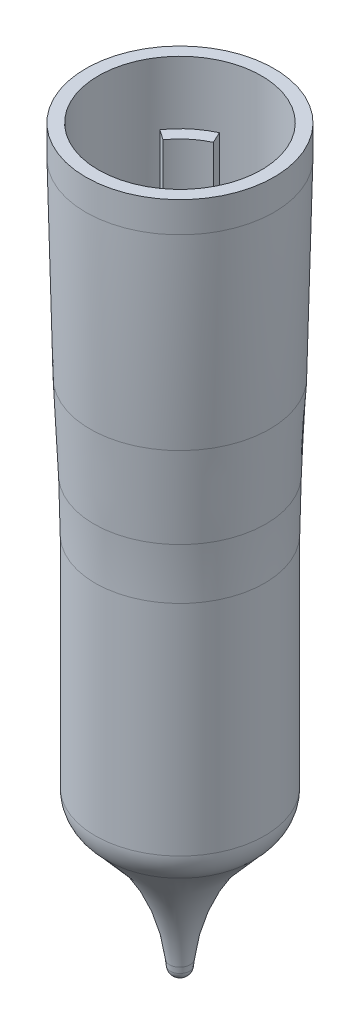
ISO-10303-21;
HEADER;
FILE_DESCRIPTION(('STEP AP214'),'2;1');
FILE_NAME('part.step','',(''),(''),'','','');
FILE_SCHEMA(('AUTOMOTIVE_DESIGN { 1 0 10303 214 1 1 1 1 }'));
ENDSEC;
DATA;
#1=APPLICATION_CONTEXT('core data for automotive mechanical design processes');
#2=APPLICATION_PROTOCOL_DEFINITION('international standard','automotive_design',2000,#1);
#3=PRODUCT_CONTEXT('',#1,'mechanical');
#4=PRODUCT('Part','Part','',(#3));
#5=PRODUCT_RELATED_PRODUCT_CATEGORY('part','',(#4));
#6=PRODUCT_DEFINITION_FORMATION('','',#4);
#7=PRODUCT_DEFINITION_CONTEXT('part definition',#1,'design');
#8=PRODUCT_DEFINITION('design','',#6,#7);
#9=PRODUCT_DEFINITION_SHAPE('','',#8);
#10=(LENGTH_UNIT() NAMED_UNIT(*) SI_UNIT(.MILLI.,.METRE.));
#11=(NAMED_UNIT(*) PLANE_ANGLE_UNIT() SI_UNIT($,.RADIAN.));
#12=(NAMED_UNIT(*) SI_UNIT($,.STERADIAN.) SOLID_ANGLE_UNIT());
#13=UNCERTAINTY_MEASURE_WITH_UNIT(LENGTH_MEASURE(1.E-05),#10,'distance_accuracy_value','');
#14=(GEOMETRIC_REPRESENTATION_CONTEXT(3) GLOBAL_UNCERTAINTY_ASSIGNED_CONTEXT((#13)) GLOBAL_UNIT_ASSIGNED_CONTEXT((#10,
#11,#12)) REPRESENTATION_CONTEXT('',''));
#15=CARTESIAN_POINT('',(0.,0.,0.));
#16=DIRECTION('',(0.,0.,1.));
#17=DIRECTION('',(1.,0.,0.));
#18=AXIS2_PLACEMENT_3D('',#15,#16,#17);
#19=CARTESIAN_POINT('',(0.,33.,0.));
#20=DIRECTION('',(0.,1.,0.));
#21=DIRECTION('',(0.,0.,1.));
#22=AXIS2_PLACEMENT_3D('',#19,#20,#21);
#23=CYLINDRICAL_SURFACE('',#22,6.5);
#24=CARTESIAN_POINT('',(0.,45.,0.));
#25=DIRECTION('',(0.,1.,0.));
#26=DIRECTION('',(0.,0.,1.));
#27=AXIS2_PLACEMENT_3D('',#24,#25,#26);
#28=CIRCLE('',#27,6.5);
#29=CARTESIAN_POINT('',(0.,45.,6.5));
#30=VERTEX_POINT('',#29);
#31=EDGE_CURVE('E114',#30,#30,#28,.T.);
#32=ORIENTED_EDGE('',*,*,#31,.T.);
#33=EDGE_LOOP('',(#32));
#34=FACE_BOUND('',#33,.T.);
#35=DIRECTION('',(0.,-1.,0.));
#36=VECTOR('',#35,1.);
#37=CARTESIAN_POINT('',(-5.32448828787845,49.0605455480127,-3.72824683628179));
#38=LINE('',#37,#36);
#39=CARTESIAN_POINT('',(-5.32448828787845,40.,-3.72824683628179));
#40=VERTEX_POINT('',#39);
#41=CARTESIAN_POINT('',(-5.32448828787845,33.,-3.72824683628179));
#42=VERTEX_POINT('',#41);
#43=EDGE_CURVE('E86',#40,#42,#38,.T.);
#44=ORIENTED_EDGE('',*,*,#43,.F.);
#45=CARTESIAN_POINT('',(0.,40.,0.));
#46=DIRECTION('',(0.,1.,0.));
#47=DIRECTION('',(0.,0.,1.));
#48=AXIS2_PLACEMENT_3D('',#45,#46,#47);
#49=CIRCLE('',#48,6.5);
#50=CARTESIAN_POINT('',(-2.74701870131455,40.,-5.89100061573822));
#51=VERTEX_POINT('',#50);
#52=EDGE_CURVE('E92',#51,#40,#49,.T.);
#53=ORIENTED_EDGE('',*,*,#52,.F.);
#54=DIRECTION('',(0.,-1.,0.));
#55=VECTOR('',#54,1.);
#56=CARTESIAN_POINT('',(-2.74701870131455,49.0605455480127,-5.89100061573822));
#57=LINE('',#56,#55);
#58=CARTESIAN_POINT('',(-2.74701870131455,33.,-5.89100061573822));
#59=VERTEX_POINT('',#58);
#60=EDGE_CURVE('E62',#51,#59,#57,.T.);
#61=ORIENTED_EDGE('',*,*,#60,.T.);
#62=CARTESIAN_POINT('',(0.,33.,0.));
#63=DIRECTION('',(0.,1.,0.));
#64=DIRECTION('',(0.,0.,1.));
#65=AXIS2_PLACEMENT_3D('',#62,#63,#64);
#66=CIRCLE('',#65,6.5);
#67=EDGE_CURVE('E101',#42,#59,#66,.T.);
#68=ORIENTED_EDGE('',*,*,#67,.F.);
#69=EDGE_LOOP('',(#44,#53,#61,#68));
#70=FACE_BOUND('',#69,.T.);
#71=ADVANCED_FACE('F39',(#34,#70),#23,.F.);
#72=CARTESIAN_POINT('',(0.,33.,0.));
#73=DIRECTION('',(0.,1.,0.));
#74=DIRECTION('',(0.,0.,1.));
#75=AXIS2_PLACEMENT_3D('',#72,#73,#74);
#76=PLANE('',#75);
#77=CARTESIAN_POINT('',(0.,33.,0.));
#78=DIRECTION('',(0.,-1.,0.));
#79=DIRECTION('',(0.,0.,1.));
#80=AXIS2_PLACEMENT_3D('',#77,#78,#79);
#81=CIRCLE('',#80,5.5);
#82=CARTESIAN_POINT('',(-4.50533624358946,33.,-3.15467039993074));
#83=VERTEX_POINT('',#82);
#84=CARTESIAN_POINT('',(-2.32440043957385,33.,-4.98469282870157));
#85=VERTEX_POINT('',#84);
#86=EDGE_CURVE('E54',#83,#85,#81,.T.);
#87=ORIENTED_EDGE('',*,*,#86,.F.);
#88=DIRECTION('',(0.819152044288993,0.,0.573576436351044));
#89=VECTOR('',#88,1.);
#90=CARTESIAN_POINT('',(-5.32448828787845,33.,-3.72824683628179));
#91=LINE('',#90,#89);
#92=EDGE_CURVE('E102',#42,#83,#91,.T.);
#93=ORIENTED_EDGE('',*,*,#92,.F.);
#94=ORIENTED_EDGE('',*,*,#67,.T.);
#95=DIRECTION('',(-0.4226182617407,0.,-0.90630778703665));
#96=VECTOR('',#95,1.);
#97=CARTESIAN_POINT('',(-2.32440043957385,33.,-4.98469282870157));
#98=LINE('',#97,#96);
#99=EDGE_CURVE('E110',#85,#59,#98,.T.);
#100=ORIENTED_EDGE('',*,*,#99,.F.);
#101=EDGE_LOOP('',(#87,#93,#94,#100));
#102=FACE_BOUND('',#101,.T.);
#103=ADVANCED_FACE('F155',(#102),#76,.T.);
#104=CARTESIAN_POINT('',(0.,18.6675522733988,0.));
#105=DIRECTION('',(0.,-1.,0.));
#106=DIRECTION('',(0.,0.,-1.));
#107=AXIS2_PLACEMENT_3D('',#104,#105,#106);
#108=CYLINDRICAL_SURFACE('',#107,6.75);
#109=CARTESIAN_POINT('',(0.,16.6022019394308,0.));
#110=DIRECTION('',(0.,1.,0.));
#111=DIRECTION('',(0.,0.,1.));
#112=AXIS2_PLACEMENT_3D('',#109,#110,#111);
#113=CIRCLE('',#112,6.75);
#114=CARTESIAN_POINT('',(0.,16.6022019394308,6.75));
#115=VERTEX_POINT('',#114);
#116=EDGE_CURVE('E131',#115,#115,#113,.F.);
#117=ORIENTED_EDGE('',*,*,#116,.T.);
#118=EDGE_LOOP('',(#117));
#119=FACE_BOUND('',#118,.T.);
#120=CARTESIAN_POINT('',(0.,-0.83244772660123,0.));
#121=DIRECTION('',(0.,1.,0.));
#122=DIRECTION('',(0.,0.,1.));
#123=AXIS2_PLACEMENT_3D('',#120,#121,#122);
#124=CIRCLE('',#123,6.75);
#125=CARTESIAN_POINT('',(0.,-0.83244772660123,6.75));
#126=VERTEX_POINT('',#125);
#127=EDGE_CURVE('E119',#126,#126,#124,.T.);
#128=ORIENTED_EDGE('',*,*,#127,.T.);
#129=EDGE_LOOP('',(#128));
#130=FACE_BOUND('',#129,.T.);
#131=ADVANCED_FACE('F161',(#119,#130),#108,.T.);
#132=CARTESIAN_POINT('',(0.,-0.83244772660123,0.));
#133=DIRECTION('',(0.,1.,0.));
#134=DIRECTION('',(0.,0.,1.));
#135=AXIS2_PLACEMENT_3D('',#132,#133,#134);
#136=TOROIDAL_SURFACE('',#135,3.75,3.);
#137=CARTESIAN_POINT('',(0.,-3.07051828446054,0.));
#138=DIRECTION('',(0.,1.,0.));
#139=DIRECTION('',(0.,0.,1.));
#140=AXIS2_PLACEMENT_3D('',#137,#138,#139);
#141=CIRCLE('',#140,5.74775878875387);
#142=CARTESIAN_POINT('',(0.,-3.07051828446054,5.74775878875387));
#143=VERTEX_POINT('',#142);
#144=EDGE_CURVE('E13',#143,#143,#141,.T.);
#145=ORIENTED_EDGE('',*,*,#144,.T.);
#146=EDGE_LOOP('',(#145));
#147=FACE_BOUND('',#146,.T.);
#148=ORIENTED_EDGE('',*,*,#127,.F.);
#149=EDGE_LOOP('',(#148));
#150=FACE_BOUND('',#149,.T.);
#151=ADVANCED_FACE('F178',(#147,#150),#136,.T.);
#152=CARTESIAN_POINT('',(0.,18.6675522733988,0.));
#153=DIRECTION('',(0.,1.,0.));
#154=DIRECTION('',(0.,0.,1.));
#155=AXIS2_PLACEMENT_3D('',#152,#153,#154);
#156=CONICAL_SURFACE('',#155,6.75,0.0458886198363719);
#157=CARTESIAN_POINT('',(0.,20.7307284172682,0.));
#158=DIRECTION('',(0.,-1.,0.));
#159=DIRECTION('',(0.,0.,-1.));
#160=AXIS2_PLACEMENT_3D('',#157,#158,#159);
#161=CIRCLE('',#160,6.8447428171089);
#162=CARTESIAN_POINT('',(0.,20.7307284172682,-6.8447428171089));
#163=VERTEX_POINT('',#162);
#164=EDGE_CURVE('E128',#163,#163,#161,.F.);
#165=ORIENTED_EDGE('',*,*,#164,.T.);
#166=EDGE_LOOP('',(#165));
#167=FACE_BOUND('',#166,.T.);
#168=CARTESIAN_POINT('',(0.,27.4350208058124,0.));
#169=DIRECTION('',(0.,-1.,0.));
#170=DIRECTION('',(0.,0.,-1.));
#171=AXIS2_PLACEMENT_3D('',#168,#169,#170);
#172=CIRCLE('',#171,7.15260967060071);
#173=CARTESIAN_POINT('',(0.,27.4350208058124,-7.15260967060071));
#174=VERTEX_POINT('',#173);
#175=EDGE_CURVE('E125',#174,#174,#172,.T.);
#176=ORIENTED_EDGE('',*,*,#175,.T.);
#177=EDGE_LOOP('',(#176));
#178=FACE_BOUND('',#177,.T.);
#179=ADVANCED_FACE('F174',(#167,#178),#156,.T.);
#180=CARTESIAN_POINT('',(0.,35.,0.));
#181=DIRECTION('',(0.,1.,0.));
#182=DIRECTION('',(0.,0.,1.));
#183=AXIS2_PLACEMENT_3D('',#180,#181,#182);
#184=CYLINDRICAL_SURFACE('',#183,7.5);
#185=CARTESIAN_POINT('',(0.,42.5729512245496,0.));
#186=DIRECTION('',(0.,-1.,0.));
#187=DIRECTION('',(0.,0.,-1.));
#188=AXIS2_PLACEMENT_3D('',#185,#186,#187);
#189=CIRCLE('',#188,7.5);
#190=CARTESIAN_POINT('',(0.,42.5729512245496,-7.5));
#191=VERTEX_POINT('',#190);
#192=EDGE_CURVE('E122',#191,#191,#189,.F.);
#193=ORIENTED_EDGE('',*,*,#192,.T.);
#194=EDGE_LOOP('',(#193));
#195=FACE_BOUND('',#194,.T.);
#196=CARTESIAN_POINT('',(0.,45.,0.));
#197=DIRECTION('',(0.,1.,0.));
#198=DIRECTION('',(0.,0.,1.));
#199=AXIS2_PLACEMENT_3D('',#196,#197,#198);
#200=CIRCLE('',#199,7.5);
#201=CARTESIAN_POINT('',(0.,45.,7.5));
#202=VERTEX_POINT('',#201);
#203=EDGE_CURVE('E113',#202,#202,#200,.T.);
#204=ORIENTED_EDGE('',*,*,#203,.F.);
#205=EDGE_LOOP('',(#204));
#206=FACE_BOUND('',#205,.T.);
#207=ADVANCED_FACE('F170',(#195,#206),#184,.T.);
#208=CARTESIAN_POINT('',(0.,45.,0.));
#209=DIRECTION('',(0.,1.,0.));
#210=DIRECTION('',(0.,0.,1.));
#211=AXIS2_PLACEMENT_3D('',#208,#209,#210);
#212=PLANE('',#211);
#213=ORIENTED_EDGE('',*,*,#31,.F.);
#214=EDGE_LOOP('',(#213));
#215=FACE_BOUND('',#214,.T.);
#216=ORIENTED_EDGE('',*,*,#203,.T.);
#217=EDGE_LOOP('',(#216));
#218=FACE_BOUND('',#217,.T.);
#219=ADVANCED_FACE('F166',(#215,#218),#212,.T.);
#220=CARTESIAN_POINT('',(0.,42.5729512245496,0.));
#221=DIRECTION('',(0.,-1.,0.));
#222=DIRECTION('',(0.,0.,-1.));
#223=AXIS2_PLACEMENT_3D('',#220,#221,#222);
#224=DEGENERATE_TOROIDAL_SURFACE('',#223,322.5,330.,.F.);
#225=ORIENTED_EDGE('',*,*,#175,.F.);
#226=EDGE_LOOP('',(#225));
#227=FACE_BOUND('',#226,.T.);
#228=ORIENTED_EDGE('',*,*,#192,.F.);
#229=EDGE_LOOP('',(#228));
#230=FACE_BOUND('',#229,.T.);
#231=ADVANCED_FACE('F169',(#227,#230),#224,.F.);
#232=CARTESIAN_POINT('',(0.,16.6022019394308,0.));
#233=DIRECTION('',(0.,1.,0.));
#234=DIRECTION('',(0.,0.,1.));
#235=AXIS2_PLACEMENT_3D('',#232,#233,#234);
#236=TOROIDAL_SURFACE('',#235,96.75,90.);
#237=ORIENTED_EDGE('',*,*,#116,.F.);
#238=EDGE_LOOP('',(#237));
#239=FACE_BOUND('',#238,.T.);
#240=ORIENTED_EDGE('',*,*,#164,.F.);
#241=EDGE_LOOP('',(#240));
#242=FACE_BOUND('',#241,.T.);
#243=ADVANCED_FACE('F188',(#239,#242),#236,.F.);
#244=CARTESIAN_POINT('',(-5.32448828787845,49.0605455480127,-3.72824683628179));
#245=DIRECTION('',(0.573576436351045,0.,-0.819152044288993));
#246=DIRECTION('',(-0.819152044288993,0.,-0.573576436351045));
#247=AXIS2_PLACEMENT_3D('',#244,#245,#246);
#248=PLANE('',#247);
#249=DIRECTION('',(0.819152044288993,0.,0.573576436351045));
#250=VECTOR('',#249,1.);
#251=CARTESIAN_POINT('',(-5.32448828787845,40.,-3.72824683628179));
#252=LINE('',#251,#250);
#253=CARTESIAN_POINT('',(-4.50533624358946,40.,-3.15467039993074));
#254=VERTEX_POINT('',#253);
#255=EDGE_CURVE('E81',#40,#254,#252,.T.);
#256=ORIENTED_EDGE('',*,*,#255,.F.);
#257=ORIENTED_EDGE('',*,*,#43,.T.);
#258=ORIENTED_EDGE('',*,*,#92,.T.);
#259=DIRECTION('',(0.,-1.,0.));
#260=VECTOR('',#259,1.);
#261=CARTESIAN_POINT('',(-4.50533624358946,49.0605455480127,-3.15467039993074));
#262=LINE('',#261,#260);
#263=EDGE_CURVE('E88',#254,#83,#262,.T.);
#264=ORIENTED_EDGE('',*,*,#263,.F.);
#265=EDGE_LOOP('',(#256,#257,#258,#264));
#266=FACE_BOUND('',#265,.T.);
#267=ADVANCED_FACE('F83',(#266),#248,.F.);
#268=CARTESIAN_POINT('',(0.,49.0605455480127,0.));
#269=DIRECTION('',(0.,-1.,0.));
#270=DIRECTION('',(0.,0.,-1.));
#271=AXIS2_PLACEMENT_3D('',#268,#269,#270);
#272=CYLINDRICAL_SURFACE('',#271,5.5);
#273=CARTESIAN_POINT('',(0.,40.,0.));
#274=DIRECTION('',(0.,1.,0.));
#275=DIRECTION('',(0.,0.,1.));
#276=AXIS2_PLACEMENT_3D('',#273,#274,#275);
#277=CIRCLE('',#276,5.5);
#278=CARTESIAN_POINT('',(-2.32440043957385,40.,-4.98469282870157));
#279=VERTEX_POINT('',#278);
#280=EDGE_CURVE('E91',#254,#279,#277,.F.);
#281=ORIENTED_EDGE('',*,*,#280,.F.);
#282=ORIENTED_EDGE('',*,*,#263,.T.);
#283=ORIENTED_EDGE('',*,*,#86,.T.);
#284=DIRECTION('',(0.,-1.,0.));
#285=VECTOR('',#284,1.);
#286=CARTESIAN_POINT('',(-2.32440043957385,49.0605455480127,-4.98469282870157));
#287=LINE('',#286,#285);
#288=EDGE_CURVE('E109',#279,#85,#287,.T.);
#289=ORIENTED_EDGE('',*,*,#288,.F.);
#290=EDGE_LOOP('',(#281,#282,#283,#289));
#291=FACE_BOUND('',#290,.T.);
#292=ADVANCED_FACE('F195',(#291),#272,.F.);
#293=CARTESIAN_POINT('',(-2.32440043957385,49.0605455480127,-4.98469282870157));
#294=DIRECTION('',(-0.90630778703665,0.,0.4226182617407));
#295=DIRECTION('',(0.4226182617407,0.,0.90630778703665));
#296=AXIS2_PLACEMENT_3D('',#293,#294,#295);
#297=PLANE('',#296);
#298=DIRECTION('',(-0.4226182617407,0.,-0.90630778703665));
#299=VECTOR('',#298,1.);
#300=CARTESIAN_POINT('',(-2.32440043957385,40.,-4.98469282870157));
#301=LINE('',#300,#299);
#302=EDGE_CURVE('E96',#279,#51,#301,.T.);
#303=ORIENTED_EDGE('',*,*,#302,.F.);
#304=ORIENTED_EDGE('',*,*,#288,.T.);
#305=ORIENTED_EDGE('',*,*,#99,.T.);
#306=ORIENTED_EDGE('',*,*,#60,.F.);
#307=EDGE_LOOP('',(#303,#304,#305,#306));
#308=FACE_BOUND('',#307,.T.);
#309=ADVANCED_FACE('F213',(#308),#297,.F.);
#310=CARTESIAN_POINT('',(0.,40.,0.));
#311=DIRECTION('',(0.,1.,0.));
#312=DIRECTION('',(0.,0.,1.));
#313=AXIS2_PLACEMENT_3D('',#310,#311,#312);
#314=PLANE('',#313);
#315=ORIENTED_EDGE('',*,*,#302,.T.);
#316=ORIENTED_EDGE('',*,*,#52,.T.);
#317=ORIENTED_EDGE('',*,*,#255,.T.);
#318=ORIENTED_EDGE('',*,*,#280,.T.);
#319=EDGE_LOOP('',(#315,#316,#317,#318));
#320=FACE_BOUND('',#319,.T.);
#321=ADVANCED_FACE('F95',(#320),#314,.T.);
#322=CARTESIAN_POINT('',(0.,-3.83244772660123,0.));
#323=DIRECTION('',(0.,1.,0.));
#324=DIRECTION('',(0.,0.,-1.));
#325=AXIS2_PLACEMENT_3D('',#322,#323,#324);
#326=CONICAL_SURFACE('',#325,1.75,0.10471975511966);
#327=CARTESIAN_POINT('',(0.,-12.6929441247423,0.));
#328=DIRECTION('',(0.,-1.,0.));
#329=DIRECTION('',(0.,0.,-1.));
#330=AXIS2_PLACEMENT_3D('',#327,#328,#329);
#331=CIRCLE('',#330,0.818724301999102);
#332=CARTESIAN_POINT('',(0.,-12.6929441247423,-0.818724301999102));
#333=VERTEX_POINT('',#332);
#334=EDGE_CURVE('E47',#333,#333,#331,.T.);
#335=ORIENTED_EDGE('',*,*,#334,.T.);
#336=EDGE_LOOP('',(#335));
#337=FACE_BOUND('',#336,.T.);
#338=CARTESIAN_POINT('',(0.,-13.160844074052,0.));
#339=DIRECTION('',(0.,1.,0.));
#340=DIRECTION('',(0.,0.,1.));
#341=AXIS2_PLACEMENT_3D('',#338,#339,#340);
#342=CIRCLE('',#341,0.769546035646058);
#343=CARTESIAN_POINT('',(0.,-13.160844074052,0.769546035646058));
#344=VERTEX_POINT('',#343);
#345=EDGE_CURVE('E137',#344,#344,#342,.T.);
#346=ORIENTED_EDGE('',*,*,#345,.T.);
#347=EDGE_LOOP('',(#346));
#348=FACE_BOUND('',#347,.T.);
#349=ADVANCED_FACE('F142',(#337,#348),#326,.T.);
#350=CARTESIAN_POINT('',(0.,-13.8324477266012,0.));
#351=DIRECTION('',(0.,-1.,0.));
#352=DIRECTION('',(0.,0.,-1.));
#353=AXIS2_PLACEMENT_3D('',#350,#351,#352);
#354=PLANE('',#353);
#355=CARTESIAN_POINT('',(0.,-13.8324477266012,0.));
#356=DIRECTION('',(0.,-1.,0.));
#357=DIRECTION('',(0.,0.,-1.));
#358=AXIS2_PLACEMENT_3D('',#355,#356,#357);
#359=CIRCLE('',#358,0.0236546141198532);
#360=CARTESIAN_POINT('',(0.,-13.8324477266012,-0.0236546141198532));
#361=VERTEX_POINT('',#360);
#362=EDGE_CURVE('E134',#361,#361,#359,.T.);
#363=ORIENTED_EDGE('',*,*,#362,.T.);
#364=EDGE_LOOP('',(#363));
#365=FACE_BOUND('',#364,.T.);
#366=ADVANCED_FACE('F151',(#365),#354,.T.);
#367=CARTESIAN_POINT('',(0.,-13.0824477266012,0.));
#368=DIRECTION('',(0.,-1.,0.));
#369=DIRECTION('',(0.,0.,-1.));
#370=AXIS2_PLACEMENT_3D('',#367,#368,#369);
#371=DEGENERATE_TOROIDAL_SURFACE('',#370,0.0236546141198532,0.75,.T.);
#372=ORIENTED_EDGE('',*,*,#345,.F.);
#373=EDGE_LOOP('',(#372));
#374=FACE_BOUND('',#373,.T.);
#375=ORIENTED_EDGE('',*,*,#362,.F.);
#376=EDGE_LOOP('',(#375));
#377=FACE_BOUND('',#376,.T.);
#378=ADVANCED_FACE('F146',(#374,#377),#371,.T.);
#379=CARTESIAN_POINT('',(0.,-14.2608710737571,0.));
#380=DIRECTION('',(0.,-1.,0.));
#381=DIRECTION('',(0.,0.,-1.));
#382=AXIS2_PLACEMENT_3D('',#379,#380,#381);
#383=TOROIDAL_SURFACE('',#382,15.7365527325232,15.);
#384=ORIENTED_EDGE('',*,*,#144,.F.);
#385=EDGE_LOOP('',(#384));
#386=FACE_BOUND('',#385,.T.);
#387=ORIENTED_EDGE('',*,*,#334,.F.);
#388=EDGE_LOOP('',(#387));
#389=FACE_BOUND('',#388,.T.);
#390=ADVANCED_FACE('F41',(#386,#389),#383,.F.);
#391=CLOSED_SHELL('',(#71,#103,#131,#151,#179,#207,#219,#231,#243,#267,#292,#309,#321,#349,#366,
#378,#390));
#392=MANIFOLD_SOLID_BREP('B2',#391);
#393=ADVANCED_BREP_SHAPE_REPRESENTATION('',(#18,#392),#14);
#394=SHAPE_DEFINITION_REPRESENTATION(#9,#393);
ENDSEC;
END-ISO-10303-21;
